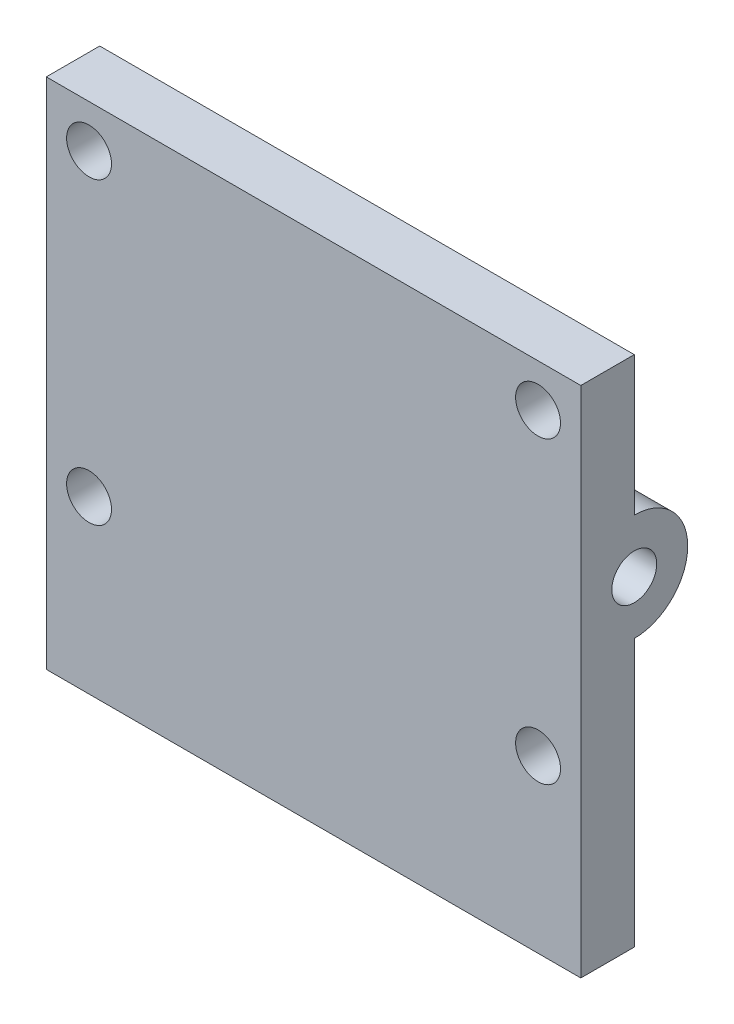
ISO-10303-21;
HEADER;
FILE_DESCRIPTION(('STEP AP214'),'2;1');
FILE_NAME('part.step','',(''),(''),'','','');
FILE_SCHEMA(('AUTOMOTIVE_DESIGN { 1 0 10303 214 1 1 1 1 }'));
ENDSEC;
DATA;
#1=APPLICATION_CONTEXT('core data for automotive mechanical design processes');
#2=APPLICATION_PROTOCOL_DEFINITION('international standard','automotive_design',2000,#1);
#3=PRODUCT_CONTEXT('',#1,'mechanical');
#4=PRODUCT('Part','Part','',(#3));
#5=PRODUCT_RELATED_PRODUCT_CATEGORY('part','',(#4));
#6=PRODUCT_DEFINITION_FORMATION('','',#4);
#7=PRODUCT_DEFINITION_CONTEXT('part definition',#1,'design');
#8=PRODUCT_DEFINITION('design','',#6,#7);
#9=PRODUCT_DEFINITION_SHAPE('','',#8);
#10=(LENGTH_UNIT() NAMED_UNIT(*) SI_UNIT(.MILLI.,.METRE.));
#11=(NAMED_UNIT(*) PLANE_ANGLE_UNIT() SI_UNIT($,.RADIAN.));
#12=(NAMED_UNIT(*) SI_UNIT($,.STERADIAN.) SOLID_ANGLE_UNIT());
#13=UNCERTAINTY_MEASURE_WITH_UNIT(LENGTH_MEASURE(1.E-05),#10,'distance_accuracy_value','');
#14=(GEOMETRIC_REPRESENTATION_CONTEXT(3) GLOBAL_UNCERTAINTY_ASSIGNED_CONTEXT((#13)) GLOBAL_UNIT_ASSIGNED_CONTEXT((#10,
#11,#12)) REPRESENTATION_CONTEXT('',''));
#15=CARTESIAN_POINT('',(0.,0.,0.));
#16=DIRECTION('',(0.,0.,1.));
#17=DIRECTION('',(1.,0.,0.));
#18=AXIS2_PLACEMENT_3D('',#15,#16,#17);
#19=CARTESIAN_POINT('',(0.,0.,5.));
#20=DIRECTION('',(0.,0.,-1.));
#21=DIRECTION('',(-1.,0.,0.));
#22=AXIS2_PLACEMENT_3D('',#19,#20,#21);
#23=PLANE('',#22);
#24=DIRECTION('',(1.,0.,0.));
#25=VECTOR('',#24,1.);
#26=CARTESIAN_POINT('',(24.8811428386954,0.175085843162366,5.));
#27=LINE('',#26,#25);
#28=CARTESIAN_POINT('',(-0.118857533833616,0.175085843162366,5.));
#29=VERTEX_POINT('',#28);
#30=CARTESIAN_POINT('',(24.8811428386954,0.175085843162366,5.));
#31=VERTEX_POINT('',#30);
#32=EDGE_CURVE('E147',#29,#31,#27,.T.);
#33=ORIENTED_EDGE('',*,*,#32,.T.);
#34=DIRECTION('',(0.,1.,0.));
#35=VECTOR('',#34,1.);
#36=CARTESIAN_POINT('',(24.8811428386954,24.1750858431624,5.));
#37=LINE('',#36,#35);
#38=CARTESIAN_POINT('',(24.8811428386954,24.1750858431624,5.));
#39=VERTEX_POINT('',#38);
#40=EDGE_CURVE('E150',#31,#39,#37,.T.);
#41=ORIENTED_EDGE('',*,*,#40,.T.);
#42=DIRECTION('',(-1.,0.,0.));
#43=VECTOR('',#42,1.);
#44=CARTESIAN_POINT('',(-0.118857533833616,24.1750858431624,5.));
#45=LINE('',#44,#43);
#46=CARTESIAN_POINT('',(-0.118857533833616,24.1750858431624,5.));
#47=VERTEX_POINT('',#46);
#48=EDGE_CURVE('E152',#39,#47,#45,.T.);
#49=ORIENTED_EDGE('',*,*,#48,.T.);
#50=DIRECTION('',(0.,-1.,0.));
#51=VECTOR('',#50,1.);
#52=CARTESIAN_POINT('',(-0.118857533833616,0.175085843162366,5.));
#53=LINE('',#52,#51);
#54=EDGE_CURVE('E154',#47,#29,#53,.T.);
#55=ORIENTED_EDGE('',*,*,#54,.T.);
#56=EDGE_LOOP('',(#33,#41,#49,#55));
#57=FACE_BOUND('',#56,.T.);
#58=CARTESIAN_POINT('',(22.8811426524309,22.1750859474705,5.));
#59=DIRECTION('',(0.,0.,1.));
#60=DIRECTION('',(1.,0.,0.));
#61=AXIS2_PLACEMENT_3D('',#58,#59,#60);
#62=CIRCLE('',#61,1.05);
#63=CARTESIAN_POINT('',(23.9311426524309,22.1750859474705,5.));
#64=VERTEX_POINT('',#63);
#65=EDGE_CURVE('E144',#64,#64,#62,.T.);
#66=ORIENTED_EDGE('',*,*,#65,.F.);
#67=EDGE_LOOP('',(#66));
#68=FACE_BOUND('',#67,.T.);
#69=CARTESIAN_POINT('',(22.8811426524309,8.17508594747048,5.));
#70=DIRECTION('',(0.,0.,1.));
#71=DIRECTION('',(1.,0.,0.));
#72=AXIS2_PLACEMENT_3D('',#69,#70,#71);
#73=CIRCLE('',#72,1.05);
#74=CARTESIAN_POINT('',(23.9311426524309,8.17508594747048,5.));
#75=VERTEX_POINT('',#74);
#76=EDGE_CURVE('E141',#75,#75,#73,.T.);
#77=ORIENTED_EDGE('',*,*,#76,.F.);
#78=EDGE_LOOP('',(#77));
#79=FACE_BOUND('',#78,.T.);
#80=CARTESIAN_POINT('',(1.8811426524309,22.1750859474705,5.));
#81=DIRECTION('',(0.,0.,1.));
#82=DIRECTION('',(1.,0.,0.));
#83=AXIS2_PLACEMENT_3D('',#80,#81,#82);
#84=CIRCLE('',#83,1.05);
#85=CARTESIAN_POINT('',(2.9311426524309,22.1750859474705,5.));
#86=VERTEX_POINT('',#85);
#87=EDGE_CURVE('E138',#86,#86,#84,.T.);
#88=ORIENTED_EDGE('',*,*,#87,.F.);
#89=EDGE_LOOP('',(#88));
#90=FACE_BOUND('',#89,.T.);
#91=CARTESIAN_POINT('',(1.8811426524309,8.17508594747048,5.));
#92=DIRECTION('',(0.,0.,1.));
#93=DIRECTION('',(1.,0.,0.));
#94=AXIS2_PLACEMENT_3D('',#91,#92,#93);
#95=CIRCLE('',#94,1.05);
#96=CARTESIAN_POINT('',(2.9311426524309,8.17508594747048,5.));
#97=VERTEX_POINT('',#96);
#98=EDGE_CURVE('E133',#97,#97,#95,.T.);
#99=ORIENTED_EDGE('',*,*,#98,.F.);
#100=EDGE_LOOP('',(#99));
#101=FACE_BOUND('',#100,.T.);
#102=ADVANCED_FACE('F33',(#57,#68,#79,#90,#101),#23,.F.);
#103=CARTESIAN_POINT('',(24.8811428386954,0.175085843162366,5.));
#104=DIRECTION('',(0.,1.,0.));
#105=DIRECTION('',(0.,0.,1.));
#106=AXIS2_PLACEMENT_3D('',#103,#104,#105);
#107=PLANE('',#106);
#108=DIRECTION('',(0.,0.,-1.));
#109=VECTOR('',#108,1.);
#110=CARTESIAN_POINT('',(-0.118857533833616,0.175085843162366,5.));
#111=LINE('',#110,#109);
#112=CARTESIAN_POINT('',(-0.118857533833616,0.175085843162366,2.5));
#113=VERTEX_POINT('',#112);
#114=EDGE_CURVE('E156',#29,#113,#111,.T.);
#115=ORIENTED_EDGE('',*,*,#114,.T.);
#116=DIRECTION('',(-1.,0.,0.));
#117=VECTOR('',#116,1.);
#118=CARTESIAN_POINT('',(24.8811428386954,0.175085843162366,2.5));
#119=LINE('',#118,#117);
#120=CARTESIAN_POINT('',(24.8811428386954,0.175085843162366,2.5));
#121=VERTEX_POINT('',#120);
#122=EDGE_CURVE('E118',#121,#113,#119,.T.);
#123=ORIENTED_EDGE('',*,*,#122,.F.);
#124=DIRECTION('',(0.,0.,-1.));
#125=VECTOR('',#124,1.);
#126=CARTESIAN_POINT('',(24.8811428386954,0.175085843162366,5.));
#127=LINE('',#126,#125);
#128=EDGE_CURVE('E164',#31,#121,#127,.T.);
#129=ORIENTED_EDGE('',*,*,#128,.F.);
#130=ORIENTED_EDGE('',*,*,#32,.F.);
#131=EDGE_LOOP('',(#115,#123,#129,#130));
#132=FACE_BOUND('',#131,.T.);
#133=ADVANCED_FACE('F188',(#132),#107,.F.);
#134=CARTESIAN_POINT('',(24.8811428386954,24.1750858431624,5.));
#135=DIRECTION('',(-1.,0.,0.));
#136=DIRECTION('',(0.,0.,1.));
#137=AXIS2_PLACEMENT_3D('',#134,#135,#136);
#138=PLANE('',#137);
#139=CARTESIAN_POINT('',(24.8811428386954,15.1750858431624,2.5));
#140=DIRECTION('',(1.,0.,0.));
#141=DIRECTION('',(0.,0.,-1.));
#142=AXIS2_PLACEMENT_3D('',#139,#140,#141);
#143=CIRCLE('',#142,1.05);
#144=CARTESIAN_POINT('',(24.8811428386954,15.1750858431624,1.45));
#145=VERTEX_POINT('',#144);
#146=EDGE_CURVE('E129',#145,#145,#143,.T.);
#147=ORIENTED_EDGE('',*,*,#146,.F.);
#148=EDGE_LOOP('',(#147));
#149=FACE_BOUND('',#148,.T.);
#150=DIRECTION('',(0.,1.,0.));
#151=VECTOR('',#150,1.);
#152=CARTESIAN_POINT('',(24.8811428386954,12.6750858431624,2.5));
#153=LINE('',#152,#151);
#154=CARTESIAN_POINT('',(24.8811428386954,12.6750858431624,2.5));
#155=VERTEX_POINT('',#154);
#156=EDGE_CURVE('E112',#121,#155,#153,.T.);
#157=ORIENTED_EDGE('',*,*,#156,.T.);
#158=CARTESIAN_POINT('',(24.8811428386954,15.1750858431624,2.5));
#159=DIRECTION('',(-1.,0.,0.));
#160=DIRECTION('',(0.,0.,1.));
#161=AXIS2_PLACEMENT_3D('',#158,#159,#160);
#162=CIRCLE('',#161,2.5);
#163=CARTESIAN_POINT('',(24.8811428386954,15.1750858431624,0.));
#164=VERTEX_POINT('',#163);
#165=EDGE_CURVE('E11',#155,#164,#162,.F.);
#166=ORIENTED_EDGE('',*,*,#165,.T.);
#167=CARTESIAN_POINT('',(24.8811428386954,15.1750858431624,2.5));
#168=DIRECTION('',(-1.,0.,0.));
#169=DIRECTION('',(0.,0.,1.));
#170=AXIS2_PLACEMENT_3D('',#167,#168,#169);
#171=CIRCLE('',#170,2.5);
#172=CARTESIAN_POINT('',(24.8811428386954,17.6750858431624,2.5));
#173=VERTEX_POINT('',#172);
#174=EDGE_CURVE('E42',#164,#173,#171,.F.);
#175=ORIENTED_EDGE('',*,*,#174,.T.);
#176=DIRECTION('',(0.,1.,0.));
#177=VECTOR('',#176,1.);
#178=CARTESIAN_POINT('',(24.8811428386954,24.1750858431624,2.5));
#179=LINE('',#178,#177);
#180=CARTESIAN_POINT('',(24.8811428386954,24.1750858431624,2.5));
#181=VERTEX_POINT('',#180);
#182=EDGE_CURVE('E93',#173,#181,#179,.T.);
#183=ORIENTED_EDGE('',*,*,#182,.T.);
#184=DIRECTION('',(0.,0.,-1.));
#185=VECTOR('',#184,1.);
#186=CARTESIAN_POINT('',(24.8811428386954,24.1750858431624,5.));
#187=LINE('',#186,#185);
#188=EDGE_CURVE('E162',#39,#181,#187,.T.);
#189=ORIENTED_EDGE('',*,*,#188,.F.);
#190=ORIENTED_EDGE('',*,*,#40,.F.);
#191=ORIENTED_EDGE('',*,*,#128,.T.);
#192=EDGE_LOOP('',(#157,#166,#175,#183,#189,#190,#191));
#193=FACE_BOUND('',#192,.T.);
#194=ADVANCED_FACE('F91',(#149,#193),#138,.F.);
#195=CARTESIAN_POINT('',(-0.118857533833616,24.1750858431624,5.));
#196=DIRECTION('',(0.,-1.,0.));
#197=DIRECTION('',(0.,0.,-1.));
#198=AXIS2_PLACEMENT_3D('',#195,#196,#197);
#199=PLANE('',#198);
#200=ORIENTED_EDGE('',*,*,#188,.T.);
#201=DIRECTION('',(-1.,0.,0.));
#202=VECTOR('',#201,1.);
#203=CARTESIAN_POINT('',(24.8811428386954,24.1750858431624,2.5));
#204=LINE('',#203,#202);
#205=CARTESIAN_POINT('',(-0.118857533833616,24.1750858431624,2.5));
#206=VERTEX_POINT('',#205);
#207=EDGE_CURVE('E104',#181,#206,#204,.T.);
#208=ORIENTED_EDGE('',*,*,#207,.T.);
#209=DIRECTION('',(0.,0.,-1.));
#210=VECTOR('',#209,1.);
#211=CARTESIAN_POINT('',(-0.118857533833616,24.1750858431624,5.));
#212=LINE('',#211,#210);
#213=EDGE_CURVE('E159',#47,#206,#212,.T.);
#214=ORIENTED_EDGE('',*,*,#213,.F.);
#215=ORIENTED_EDGE('',*,*,#48,.F.);
#216=EDGE_LOOP('',(#200,#208,#214,#215));
#217=FACE_BOUND('',#216,.T.);
#218=ADVANCED_FACE('F203',(#217),#199,.F.);
#219=CARTESIAN_POINT('',(-0.118857533833616,0.175085843162366,5.));
#220=DIRECTION('',(1.,0.,0.));
#221=DIRECTION('',(0.,0.,-1.));
#222=AXIS2_PLACEMENT_3D('',#219,#220,#221);
#223=PLANE('',#222);
#224=CARTESIAN_POINT('',(-0.118857533833616,15.1750858431624,2.5));
#225=DIRECTION('',(1.,0.,0.));
#226=DIRECTION('',(0.,0.,-1.));
#227=AXIS2_PLACEMENT_3D('',#224,#225,#226);
#228=CIRCLE('',#227,1.05);
#229=CARTESIAN_POINT('',(-0.118857533833616,15.1750858431624,1.45));
#230=VERTEX_POINT('',#229);
#231=EDGE_CURVE('E130',#230,#230,#228,.T.);
#232=ORIENTED_EDGE('',*,*,#231,.T.);
#233=EDGE_LOOP('',(#232));
#234=FACE_BOUND('',#233,.T.);
#235=CARTESIAN_POINT('',(-0.118857533833616,15.1750858431624,2.5));
#236=DIRECTION('',(1.,0.,0.));
#237=DIRECTION('',(0.,0.,-1.));
#238=AXIS2_PLACEMENT_3D('',#235,#236,#237);
#239=CIRCLE('',#238,2.5);
#240=CARTESIAN_POINT('',(-0.118857533833616,17.6750858431624,2.5));
#241=VERTEX_POINT('',#240);
#242=CARTESIAN_POINT('',(-0.118857533833616,15.1750858431624,0.));
#243=VERTEX_POINT('',#242);
#244=EDGE_CURVE('E55',#241,#243,#239,.F.);
#245=ORIENTED_EDGE('',*,*,#244,.T.);
#246=CARTESIAN_POINT('',(-0.118857533833616,15.1750858431624,2.5));
#247=DIRECTION('',(1.,0.,0.));
#248=DIRECTION('',(0.,0.,-1.));
#249=AXIS2_PLACEMENT_3D('',#246,#247,#248);
#250=CIRCLE('',#249,2.5);
#251=CARTESIAN_POINT('',(-0.118857533833616,12.6750858431624,2.5));
#252=VERTEX_POINT('',#251);
#253=EDGE_CURVE('E98',#243,#252,#250,.F.);
#254=ORIENTED_EDGE('',*,*,#253,.T.);
#255=DIRECTION('',(0.,1.,0.));
#256=VECTOR('',#255,1.);
#257=CARTESIAN_POINT('',(-0.118857533833616,12.6750858431624,2.5));
#258=LINE('',#257,#256);
#259=EDGE_CURVE('E115',#113,#252,#258,.T.);
#260=ORIENTED_EDGE('',*,*,#259,.F.);
#261=ORIENTED_EDGE('',*,*,#114,.F.);
#262=ORIENTED_EDGE('',*,*,#54,.F.);
#263=ORIENTED_EDGE('',*,*,#213,.T.);
#264=DIRECTION('',(0.,1.,0.));
#265=VECTOR('',#264,1.);
#266=CARTESIAN_POINT('',(-0.118857533833616,24.1750858431624,2.5));
#267=LINE('',#266,#265);
#268=EDGE_CURVE('E105',#241,#206,#267,.T.);
#269=ORIENTED_EDGE('',*,*,#268,.F.);
#270=EDGE_LOOP('',(#245,#254,#260,#261,#262,#263,#269));
#271=FACE_BOUND('',#270,.T.);
#272=ADVANCED_FACE('F174',(#234,#271),#223,.F.);
#273=CARTESIAN_POINT('',(22.8811426524309,22.1750859474705,5.));
#274=DIRECTION('',(0.,0.,-1.));
#275=DIRECTION('',(-1.,0.,0.));
#276=AXIS2_PLACEMENT_3D('',#273,#274,#275);
#277=CYLINDRICAL_SURFACE('',#276,1.05);
#278=CARTESIAN_POINT('',(22.8811426524309,22.1750859474705,2.5));
#279=DIRECTION('',(0.,0.,1.));
#280=DIRECTION('',(0.,-1.,0.));
#281=AXIS2_PLACEMENT_3D('',#278,#279,#280);
#282=CIRCLE('',#281,1.05);
#283=CARTESIAN_POINT('',(22.8811426524309,21.1250859474705,2.5));
#284=VERTEX_POINT('',#283);
#285=EDGE_CURVE('E126',#284,#284,#282,.T.);
#286=ORIENTED_EDGE('',*,*,#285,.F.);
#287=EDGE_LOOP('',(#286));
#288=FACE_BOUND('',#287,.T.);
#289=ORIENTED_EDGE('',*,*,#65,.T.);
#290=EDGE_LOOP('',(#289));
#291=FACE_BOUND('',#290,.T.);
#292=ADVANCED_FACE('F199',(#288,#291),#277,.F.);
#293=CARTESIAN_POINT('',(22.8811426524309,8.17508594747048,5.));
#294=DIRECTION('',(0.,0.,-1.));
#295=DIRECTION('',(-1.,0.,0.));
#296=AXIS2_PLACEMENT_3D('',#293,#294,#295);
#297=CYLINDRICAL_SURFACE('',#296,1.05);
#298=CARTESIAN_POINT('',(22.8811426524309,8.17508594747048,2.5));
#299=DIRECTION('',(0.,0.,1.));
#300=DIRECTION('',(0.,-1.,0.));
#301=AXIS2_PLACEMENT_3D('',#298,#299,#300);
#302=CIRCLE('',#301,1.05);
#303=CARTESIAN_POINT('',(22.8811426524309,7.12508594747048,2.5));
#304=VERTEX_POINT('',#303);
#305=EDGE_CURVE('E122',#304,#304,#302,.T.);
#306=ORIENTED_EDGE('',*,*,#305,.F.);
#307=EDGE_LOOP('',(#306));
#308=FACE_BOUND('',#307,.T.);
#309=ORIENTED_EDGE('',*,*,#76,.T.);
#310=EDGE_LOOP('',(#309));
#311=FACE_BOUND('',#310,.T.);
#312=ADVANCED_FACE('F233',(#308,#311),#297,.F.);
#313=CARTESIAN_POINT('',(1.8811426524309,22.1750859474705,5.));
#314=DIRECTION('',(0.,0.,-1.));
#315=DIRECTION('',(-1.,0.,0.));
#316=AXIS2_PLACEMENT_3D('',#313,#314,#315);
#317=CYLINDRICAL_SURFACE('',#316,1.05);
#318=CARTESIAN_POINT('',(1.8811426524309,22.1750859474705,2.5));
#319=DIRECTION('',(0.,0.,1.));
#320=DIRECTION('',(0.,-1.,0.));
#321=AXIS2_PLACEMENT_3D('',#318,#319,#320);
#322=CIRCLE('',#321,1.05);
#323=CARTESIAN_POINT('',(1.8811426524309,21.1250859474705,2.5));
#324=VERTEX_POINT('',#323);
#325=EDGE_CURVE('E125',#324,#324,#322,.T.);
#326=ORIENTED_EDGE('',*,*,#325,.F.);
#327=EDGE_LOOP('',(#326));
#328=FACE_BOUND('',#327,.T.);
#329=ORIENTED_EDGE('',*,*,#87,.T.);
#330=EDGE_LOOP('',(#329));
#331=FACE_BOUND('',#330,.T.);
#332=ADVANCED_FACE('F226',(#328,#331),#317,.F.);
#333=CARTESIAN_POINT('',(1.8811426524309,8.17508594747048,5.));
#334=DIRECTION('',(0.,0.,-1.));
#335=DIRECTION('',(-1.,0.,0.));
#336=AXIS2_PLACEMENT_3D('',#333,#334,#335);
#337=CYLINDRICAL_SURFACE('',#336,1.05);
#338=CARTESIAN_POINT('',(1.8811426524309,8.17508594747048,2.5));
#339=DIRECTION('',(0.,0.,1.));
#340=DIRECTION('',(0.,-1.,0.));
#341=AXIS2_PLACEMENT_3D('',#338,#339,#340);
#342=CIRCLE('',#341,1.05);
#343=CARTESIAN_POINT('',(1.8811426524309,7.12508594747048,2.5));
#344=VERTEX_POINT('',#343);
#345=EDGE_CURVE('E108',#344,#344,#342,.T.);
#346=ORIENTED_EDGE('',*,*,#345,.F.);
#347=EDGE_LOOP('',(#346));
#348=FACE_BOUND('',#347,.T.);
#349=ORIENTED_EDGE('',*,*,#98,.T.);
#350=EDGE_LOOP('',(#349));
#351=FACE_BOUND('',#350,.T.);
#352=ADVANCED_FACE('F217',(#348,#351),#337,.F.);
#353=CARTESIAN_POINT('',(-0.118857533833616,15.1750858431624,2.5));
#354=DIRECTION('',(1.,0.,0.));
#355=DIRECTION('',(0.,0.,-1.));
#356=AXIS2_PLACEMENT_3D('',#353,#354,#355);
#357=CYLINDRICAL_SURFACE('',#356,1.05);
#358=ORIENTED_EDGE('',*,*,#231,.F.);
#359=EDGE_LOOP('',(#358));
#360=FACE_BOUND('',#359,.T.);
#361=ORIENTED_EDGE('',*,*,#146,.T.);
#362=EDGE_LOOP('',(#361));
#363=FACE_BOUND('',#362,.T.);
#364=ADVANCED_FACE('F215',(#360,#363),#357,.F.);
#365=CARTESIAN_POINT('',(24.8811428386954,12.6750858431624,2.5));
#366=DIRECTION('',(0.,0.,1.));
#367=DIRECTION('',(0.,-1.,0.));
#368=AXIS2_PLACEMENT_3D('',#365,#366,#367);
#369=PLANE('',#368);
#370=ORIENTED_EDGE('',*,*,#305,.T.);
#371=EDGE_LOOP('',(#370));
#372=FACE_BOUND('',#371,.T.);
#373=ORIENTED_EDGE('',*,*,#345,.T.);
#374=EDGE_LOOP('',(#373));
#375=FACE_BOUND('',#374,.T.);
#376=ORIENTED_EDGE('',*,*,#259,.T.);
#377=DIRECTION('',(-1.,0.,0.));
#378=VECTOR('',#377,1.);
#379=CARTESIAN_POINT('',(24.8811428386954,12.6750858431624,2.5));
#380=LINE('',#379,#378);
#381=EDGE_CURVE('E114',#155,#252,#380,.T.);
#382=ORIENTED_EDGE('',*,*,#381,.F.);
#383=ORIENTED_EDGE('',*,*,#156,.F.);
#384=ORIENTED_EDGE('',*,*,#122,.T.);
#385=EDGE_LOOP('',(#376,#382,#383,#384));
#386=FACE_BOUND('',#385,.T.);
#387=ADVANCED_FACE('F179',(#372,#375,#386),#369,.F.);
#388=CARTESIAN_POINT('',(24.8811428386954,24.1750858431624,2.5));
#389=DIRECTION('',(0.,0.,1.));
#390=DIRECTION('',(0.,-1.,0.));
#391=AXIS2_PLACEMENT_3D('',#388,#389,#390);
#392=PLANE('',#391);
#393=ORIENTED_EDGE('',*,*,#285,.T.);
#394=EDGE_LOOP('',(#393));
#395=FACE_BOUND('',#394,.T.);
#396=ORIENTED_EDGE('',*,*,#325,.T.);
#397=EDGE_LOOP('',(#396));
#398=FACE_BOUND('',#397,.T.);
#399=ORIENTED_EDGE('',*,*,#268,.T.);
#400=ORIENTED_EDGE('',*,*,#207,.F.);
#401=ORIENTED_EDGE('',*,*,#182,.F.);
#402=DIRECTION('',(-1.,0.,0.));
#403=VECTOR('',#402,1.);
#404=CARTESIAN_POINT('',(24.8811428386954,17.6750858431624,2.5));
#405=LINE('',#404,#403);
#406=EDGE_CURVE('E102',#173,#241,#405,.T.);
#407=ORIENTED_EDGE('',*,*,#406,.T.);
#408=EDGE_LOOP('',(#399,#400,#401,#407));
#409=FACE_BOUND('',#408,.T.);
#410=ADVANCED_FACE('F101',(#395,#398,#409),#392,.F.);
#411=CARTESIAN_POINT('',(24.8811428386954,15.1750858431624,2.5));
#412=DIRECTION('',(1.,0.,0.));
#413=DIRECTION('',(0.,0.,-1.));
#414=AXIS2_PLACEMENT_3D('',#411,#412,#413);
#415=CYLINDRICAL_SURFACE('',#414,2.5);
#416=ORIENTED_EDGE('',*,*,#406,.F.);
#417=ORIENTED_EDGE('',*,*,#174,.F.);
#418=DIRECTION('',(-1.,0.,0.));
#419=VECTOR('',#418,1.);
#420=CARTESIAN_POINT('',(24.8811428386954,15.1750858431624,0.));
#421=LINE('',#420,#419);
#422=EDGE_CURVE('E37',#243,#164,#421,.F.);
#423=ORIENTED_EDGE('',*,*,#422,.F.);
#424=ORIENTED_EDGE('',*,*,#244,.F.);
#425=EDGE_LOOP('',(#416,#417,#423,#424));
#426=FACE_BOUND('',#425,.T.);
#427=ADVANCED_FACE('F35',(#426),#415,.T.);
#428=CARTESIAN_POINT('',(0.,15.1750858431624,2.5));
#429=DIRECTION('',(1.,0.,0.));
#430=DIRECTION('',(0.,0.,-1.));
#431=AXIS2_PLACEMENT_3D('',#428,#429,#430);
#432=CYLINDRICAL_SURFACE('',#431,2.5);
#433=ORIENTED_EDGE('',*,*,#165,.F.);
#434=ORIENTED_EDGE('',*,*,#381,.T.);
#435=ORIENTED_EDGE('',*,*,#253,.F.);
#436=ORIENTED_EDGE('',*,*,#422,.T.);
#437=EDGE_LOOP('',(#433,#434,#435,#436));
#438=FACE_BOUND('',#437,.T.);
#439=ADVANCED_FACE('F181',(#438),#432,.T.);
#440=CLOSED_SHELL('',(#102,#133,#194,#218,#272,#292,#312,#332,#352,#364,#387,#410,#427,#439));
#441=MANIFOLD_SOLID_BREP('B2',#440);
#442=ADVANCED_BREP_SHAPE_REPRESENTATION('',(#18,#441),#14);
#443=SHAPE_DEFINITION_REPRESENTATION(#9,#442);
ENDSEC;
END-ISO-10303-21;
